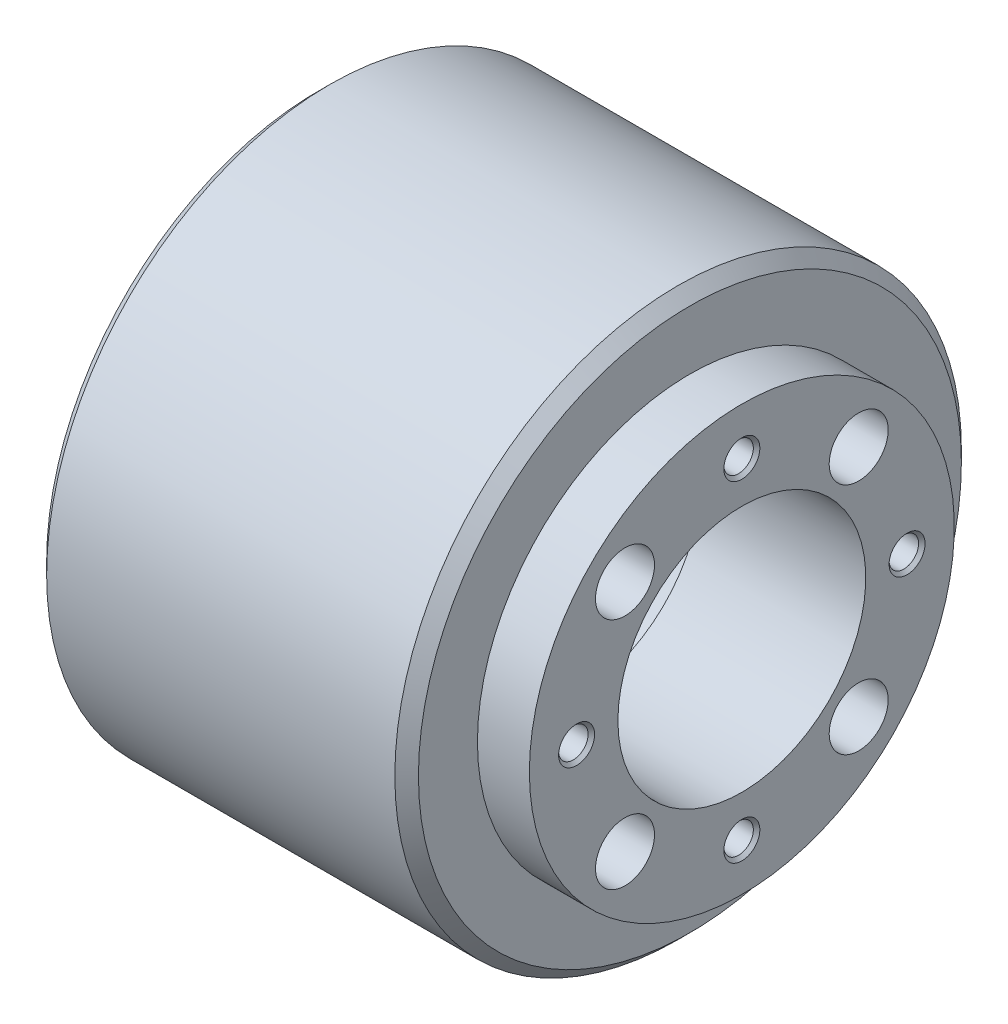
ISO-10303-21;
HEADER;
FILE_DESCRIPTION(('STEP AP214'),'2;1');
FILE_NAME('part.step','',(''),(''),'','','');
FILE_SCHEMA(('AUTOMOTIVE_DESIGN { 1 0 10303 214 1 1 1 1 }'));
ENDSEC;
DATA;
#1=APPLICATION_CONTEXT('core data for automotive mechanical design processes');
#2=APPLICATION_PROTOCOL_DEFINITION('international standard','automotive_design',2000,#1);
#3=PRODUCT_CONTEXT('',#1,'mechanical');
#4=PRODUCT('Part','Part','',(#3));
#5=PRODUCT_RELATED_PRODUCT_CATEGORY('part','',(#4));
#6=PRODUCT_DEFINITION_FORMATION('','',#4);
#7=PRODUCT_DEFINITION_CONTEXT('part definition',#1,'design');
#8=PRODUCT_DEFINITION('design','',#6,#7);
#9=PRODUCT_DEFINITION_SHAPE('','',#8);
#10=(LENGTH_UNIT() NAMED_UNIT(*) SI_UNIT(.MILLI.,.METRE.));
#11=(NAMED_UNIT(*) PLANE_ANGLE_UNIT() SI_UNIT($,.RADIAN.));
#12=(NAMED_UNIT(*) SI_UNIT($,.STERADIAN.) SOLID_ANGLE_UNIT());
#13=UNCERTAINTY_MEASURE_WITH_UNIT(LENGTH_MEASURE(1.E-05),#10,'distance_accuracy_value','');
#14=(GEOMETRIC_REPRESENTATION_CONTEXT(3) GLOBAL_UNCERTAINTY_ASSIGNED_CONTEXT((#13)) GLOBAL_UNIT_ASSIGNED_CONTEXT((#10,
#11,#12)) REPRESENTATION_CONTEXT('',''));
#15=CARTESIAN_POINT('',(0.,0.,0.));
#16=DIRECTION('',(0.,0.,1.));
#17=DIRECTION('',(1.,0.,0.));
#18=AXIS2_PLACEMENT_3D('',#15,#16,#17);
#19=CARTESIAN_POINT('',(0.,0.,-19.5));
#20=DIRECTION('',(1.,0.,0.));
#21=DIRECTION('',(0.,0.,-1.));
#22=AXIS2_PLACEMENT_3D('',#19,#20,#21);
#23=PLANE('',#22);
#24=CARTESIAN_POINT('',(0.,0.,0.));
#25=DIRECTION('',(1.,0.,0.));
#26=DIRECTION('',(0.,0.,-1.));
#27=AXIS2_PLACEMENT_3D('',#24,#25,#26);
#28=CIRCLE('',#27,20.5);
#29=CARTESIAN_POINT('',(0.,0.,-20.5));
#30=VERTEX_POINT('',#29);
#31=EDGE_CURVE('E144',#30,#30,#28,.T.);
#32=ORIENTED_EDGE('',*,*,#31,.T.);
#33=EDGE_LOOP('',(#32));
#34=FACE_BOUND('',#33,.T.);
#35=CARTESIAN_POINT('',(0.,0.,0.));
#36=DIRECTION('',(1.,0.,0.));
#37=DIRECTION('',(0.,0.,-1.));
#38=AXIS2_PLACEMENT_3D('',#35,#36,#37);
#39=CIRCLE('',#38,23.);
#40=CARTESIAN_POINT('',(0.,0.,-23.));
#41=VERTEX_POINT('',#40);
#42=EDGE_CURVE('E141',#41,#41,#39,.F.);
#43=ORIENTED_EDGE('',*,*,#42,.T.);
#44=EDGE_LOOP('',(#43));
#45=FACE_BOUND('',#44,.T.);
#46=ADVANCED_FACE('F46',(#34,#45),#23,.F.);
#47=CARTESIAN_POINT('',(0.,0.,0.));
#48=DIRECTION('',(-1.,0.,0.));
#49=DIRECTION('',(0.,0.,1.));
#50=AXIS2_PLACEMENT_3D('',#47,#48,#49);
#51=CYLINDRICAL_SURFACE('',#50,24.);
#52=CARTESIAN_POINT('',(30.5,0.,0.));
#53=DIRECTION('',(-1.,0.,0.));
#54=DIRECTION('',(0.,0.,1.));
#55=AXIS2_PLACEMENT_3D('',#52,#53,#54);
#56=CIRCLE('',#55,24.);
#57=CARTESIAN_POINT('',(30.5,0.,24.));
#58=VERTEX_POINT('',#57);
#59=EDGE_CURVE('E54',#58,#58,#56,.T.);
#60=ORIENTED_EDGE('',*,*,#59,.T.);
#61=EDGE_LOOP('',(#60));
#62=FACE_BOUND('',#61,.T.);
#63=CARTESIAN_POINT('',(0.99999999999999,0.,0.));
#64=DIRECTION('',(1.,0.,0.));
#65=DIRECTION('',(0.,0.,-1.));
#66=AXIS2_PLACEMENT_3D('',#63,#64,#65);
#67=CIRCLE('',#66,24.);
#68=CARTESIAN_POINT('',(0.99999999999999,0.,-24.));
#69=VERTEX_POINT('',#68);
#70=EDGE_CURVE('E147',#69,#69,#67,.T.);
#71=ORIENTED_EDGE('',*,*,#70,.T.);
#72=EDGE_LOOP('',(#71));
#73=FACE_BOUND('',#72,.T.);
#74=ADVANCED_FACE('F152',(#62,#73),#51,.T.);
#75=CARTESIAN_POINT('',(31.5,0.,-24.));
#76=DIRECTION('',(-1.,0.,0.));
#77=DIRECTION('',(0.,0.,1.));
#78=AXIS2_PLACEMENT_3D('',#75,#76,#77);
#79=PLANE('',#78);
#80=CARTESIAN_POINT('',(31.5,0.,0.));
#81=DIRECTION('',(-1.,0.,0.));
#82=DIRECTION('',(0.,0.,1.));
#83=AXIS2_PLACEMENT_3D('',#80,#81,#82);
#84=CIRCLE('',#83,23.);
#85=CARTESIAN_POINT('',(31.5,0.,23.));
#86=VERTEX_POINT('',#85);
#87=EDGE_CURVE('E13',#86,#86,#84,.F.);
#88=ORIENTED_EDGE('',*,*,#87,.T.);
#89=EDGE_LOOP('',(#88));
#90=FACE_BOUND('',#89,.T.);
#91=CARTESIAN_POINT('',(31.5,0.,0.));
#92=DIRECTION('',(-1.,0.,0.));
#93=DIRECTION('',(0.,0.,1.));
#94=AXIS2_PLACEMENT_3D('',#91,#92,#93);
#95=CIRCLE('',#94,18.);
#96=CARTESIAN_POINT('',(31.5,0.,18.));
#97=VERTEX_POINT('',#96);
#98=EDGE_CURVE('E123',#97,#97,#95,.T.);
#99=ORIENTED_EDGE('',*,*,#98,.T.);
#100=EDGE_LOOP('',(#99));
#101=FACE_BOUND('',#100,.T.);
#102=ADVANCED_FACE('F175',(#90,#101),#79,.F.);
#103=CARTESIAN_POINT('',(0.,0.,0.));
#104=DIRECTION('',(-1.,0.,0.));
#105=DIRECTION('',(0.,0.,1.));
#106=AXIS2_PLACEMENT_3D('',#103,#104,#105);
#107=CYLINDRICAL_SURFACE('',#106,18.);
#108=ORIENTED_EDGE('',*,*,#98,.F.);
#109=EDGE_LOOP('',(#108));
#110=FACE_BOUND('',#109,.T.);
#111=CARTESIAN_POINT('',(35.9,0.,0.));
#112=DIRECTION('',(-1.,0.,0.));
#113=DIRECTION('',(0.,0.,1.));
#114=AXIS2_PLACEMENT_3D('',#111,#112,#113);
#115=CIRCLE('',#114,18.);
#116=CARTESIAN_POINT('',(35.9,0.,18.));
#117=VERTEX_POINT('',#116);
#118=EDGE_CURVE('E120',#117,#117,#115,.T.);
#119=ORIENTED_EDGE('',*,*,#118,.T.);
#120=EDGE_LOOP('',(#119));
#121=FACE_BOUND('',#120,.T.);
#122=ADVANCED_FACE('F216',(#110,#121),#107,.T.);
#123=CARTESIAN_POINT('',(35.9,0.,-10.5));
#124=DIRECTION('',(-1.,0.,0.));
#125=DIRECTION('',(0.,0.,1.));
#126=AXIS2_PLACEMENT_3D('',#123,#124,#125);
#127=PLANE('',#126);
#128=CARTESIAN_POINT('',(35.9,-9.89949493661167,-9.89949493661166));
#129=DIRECTION('',(1.,0.,0.));
#130=DIRECTION('',(0.,0.,1.));
#131=AXIS2_PLACEMENT_3D('',#128,#129,#130);
#132=CIRCLE('',#131,2.5);
#133=CARTESIAN_POINT('',(35.9,-9.89949493661167,-7.39949493661166));
#134=VERTEX_POINT('',#133);
#135=EDGE_CURVE('E509',#134,#134,#132,.T.);
#136=ORIENTED_EDGE('',*,*,#135,.F.);
#137=EDGE_LOOP('',(#136));
#138=FACE_BOUND('',#137,.T.);
#139=CARTESIAN_POINT('',(35.9,-9.89949493661167,9.89949493661166));
#140=DIRECTION('',(1.,0.,0.));
#141=DIRECTION('',(0.,0.,-1.));
#142=AXIS2_PLACEMENT_3D('',#139,#140,#141);
#143=CIRCLE('',#142,2.5);
#144=CARTESIAN_POINT('',(35.9,-9.89949493661167,7.39949493661166));
#145=VERTEX_POINT('',#144);
#146=EDGE_CURVE('E508',#145,#145,#143,.T.);
#147=ORIENTED_EDGE('',*,*,#146,.F.);
#148=EDGE_LOOP('',(#147));
#149=FACE_BOUND('',#148,.T.);
#150=CARTESIAN_POINT('',(35.9,9.89949493661167,-9.89949493661167));
#151=DIRECTION('',(1.,0.,0.));
#152=DIRECTION('',(0.,0.,1.));
#153=AXIS2_PLACEMENT_3D('',#150,#151,#152);
#154=CIRCLE('',#153,2.5);
#155=CARTESIAN_POINT('',(35.9,9.89949493661167,-7.39949493661166));
#156=VERTEX_POINT('',#155);
#157=EDGE_CURVE('E518',#156,#156,#154,.T.);
#158=ORIENTED_EDGE('',*,*,#157,.F.);
#159=EDGE_LOOP('',(#158));
#160=FACE_BOUND('',#159,.T.);
#161=CARTESIAN_POINT('',(35.9,9.89949493661167,9.89949493661167));
#162=DIRECTION('',(1.,0.,0.));
#163=DIRECTION('',(0.,0.,-1.));
#164=AXIS2_PLACEMENT_3D('',#161,#162,#163);
#165=CIRCLE('',#164,2.5);
#166=CARTESIAN_POINT('',(35.9,9.89949493661167,7.39949493661166));
#167=VERTEX_POINT('',#166);
#168=EDGE_CURVE('E523',#167,#167,#165,.T.);
#169=ORIENTED_EDGE('',*,*,#168,.F.);
#170=EDGE_LOOP('',(#169));
#171=FACE_BOUND('',#170,.T.);
#172=CARTESIAN_POINT('',(35.9,14.,0.));
#173=DIRECTION('',(1.,0.,0.));
#174=DIRECTION('',(0.,0.,-1.));
#175=AXIS2_PLACEMENT_3D('',#172,#173,#174);
#176=CIRCLE('',#175,1.525);
#177=CARTESIAN_POINT('',(35.9,14.,-1.525));
#178=VERTEX_POINT('',#177);
#179=EDGE_CURVE('E84',#178,#178,#176,.T.);
#180=ORIENTED_EDGE('',*,*,#179,.F.);
#181=EDGE_LOOP('',(#180));
#182=FACE_BOUND('',#181,.T.);
#183=CARTESIAN_POINT('',(35.9,0.,-14.));
#184=DIRECTION('',(1.,0.,0.));
#185=DIRECTION('',(0.,0.,-1.));
#186=AXIS2_PLACEMENT_3D('',#183,#184,#185);
#187=CIRCLE('',#186,1.525);
#188=CARTESIAN_POINT('',(35.9,0.,-15.525));
#189=VERTEX_POINT('',#188);
#190=EDGE_CURVE('E77',#189,#189,#187,.T.);
#191=ORIENTED_EDGE('',*,*,#190,.F.);
#192=EDGE_LOOP('',(#191));
#193=FACE_BOUND('',#192,.T.);
#194=CARTESIAN_POINT('',(35.9,-14.,0.));
#195=DIRECTION('',(1.,0.,0.));
#196=DIRECTION('',(0.,0.,-1.));
#197=AXIS2_PLACEMENT_3D('',#194,#195,#196);
#198=CIRCLE('',#197,1.525);
#199=CARTESIAN_POINT('',(35.9,-14.,-1.525));
#200=VERTEX_POINT('',#199);
#201=EDGE_CURVE('E93',#200,#200,#198,.T.);
#202=ORIENTED_EDGE('',*,*,#201,.F.);
#203=EDGE_LOOP('',(#202));
#204=FACE_BOUND('',#203,.T.);
#205=CARTESIAN_POINT('',(35.9,0.,14.));
#206=DIRECTION('',(1.,0.,0.));
#207=DIRECTION('',(0.,0.,-1.));
#208=AXIS2_PLACEMENT_3D('',#205,#206,#207);
#209=CIRCLE('',#208,1.525);
#210=CARTESIAN_POINT('',(35.9,0.,12.475));
#211=VERTEX_POINT('',#210);
#212=EDGE_CURVE('E102',#211,#211,#209,.T.);
#213=ORIENTED_EDGE('',*,*,#212,.F.);
#214=EDGE_LOOP('',(#213));
#215=FACE_BOUND('',#214,.T.);
#216=ORIENTED_EDGE('',*,*,#118,.F.);
#217=EDGE_LOOP('',(#216));
#218=FACE_BOUND('',#217,.T.);
#219=CARTESIAN_POINT('',(35.9,0.,0.));
#220=DIRECTION('',(-1.,0.,0.));
#221=DIRECTION('',(0.,0.,1.));
#222=AXIS2_PLACEMENT_3D('',#219,#220,#221);
#223=CIRCLE('',#222,10.5);
#224=CARTESIAN_POINT('',(35.9,0.,10.5));
#225=VERTEX_POINT('',#224);
#226=EDGE_CURVE('E117',#225,#225,#223,.T.);
#227=ORIENTED_EDGE('',*,*,#226,.T.);
#228=EDGE_LOOP('',(#227));
#229=FACE_BOUND('',#228,.T.);
#230=ADVANCED_FACE('F208',(#138,#149,#160,#171,#182,#193,#204,#215,#218,#229),#127,.F.);
#231=CARTESIAN_POINT('',(0.,0.,0.));
#232=DIRECTION('',(-1.,0.,0.));
#233=DIRECTION('',(0.,0.,1.));
#234=AXIS2_PLACEMENT_3D('',#231,#232,#233);
#235=CYLINDRICAL_SURFACE('',#234,10.5);
#236=ORIENTED_EDGE('',*,*,#226,.F.);
#237=EDGE_LOOP('',(#236));
#238=FACE_BOUND('',#237,.T.);
#239=CARTESIAN_POINT('',(21.9,0.,0.));
#240=DIRECTION('',(-1.,0.,0.));
#241=DIRECTION('',(0.,0.,1.));
#242=AXIS2_PLACEMENT_3D('',#239,#240,#241);
#243=CIRCLE('',#242,10.5);
#244=CARTESIAN_POINT('',(21.9,0.,10.5));
#245=VERTEX_POINT('',#244);
#246=EDGE_CURVE('E114',#245,#245,#243,.T.);
#247=ORIENTED_EDGE('',*,*,#246,.T.);
#248=EDGE_LOOP('',(#247));
#249=FACE_BOUND('',#248,.T.);
#250=ADVANCED_FACE('F202',(#238,#249),#235,.F.);
#251=CARTESIAN_POINT('',(21.9,0.,-15.));
#252=DIRECTION('',(1.,0.,0.));
#253=DIRECTION('',(0.,0.,-1.));
#254=AXIS2_PLACEMENT_3D('',#251,#252,#253);
#255=PLANE('',#254);
#256=ORIENTED_EDGE('',*,*,#246,.F.);
#257=EDGE_LOOP('',(#256));
#258=FACE_BOUND('',#257,.T.);
#259=CARTESIAN_POINT('',(21.9,0.,0.));
#260=DIRECTION('',(-1.,0.,0.));
#261=DIRECTION('',(0.,0.,1.));
#262=AXIS2_PLACEMENT_3D('',#259,#260,#261);
#263=CIRCLE('',#262,15.);
#264=CARTESIAN_POINT('',(21.9,0.,15.));
#265=VERTEX_POINT('',#264);
#266=EDGE_CURVE('E111',#265,#265,#263,.T.);
#267=ORIENTED_EDGE('',*,*,#266,.T.);
#268=EDGE_LOOP('',(#267));
#269=FACE_BOUND('',#268,.T.);
#270=ADVANCED_FACE('F197',(#258,#269),#255,.F.);
#271=CARTESIAN_POINT('',(0.,0.,0.));
#272=DIRECTION('',(-1.,0.,0.));
#273=DIRECTION('',(0.,0.,1.));
#274=AXIS2_PLACEMENT_3D('',#271,#272,#273);
#275=CYLINDRICAL_SURFACE('',#274,15.);
#276=CARTESIAN_POINT('',(6.39999999999999,0.,0.));
#277=DIRECTION('',(1.,0.,0.));
#278=DIRECTION('',(0.,0.,-1.));
#279=AXIS2_PLACEMENT_3D('',#276,#277,#278);
#280=CIRCLE('',#279,15.);
#281=CARTESIAN_POINT('',(6.39999999999999,0.,-15.));
#282=VERTEX_POINT('',#281);
#283=EDGE_CURVE('E138',#282,#282,#280,.F.);
#284=ORIENTED_EDGE('',*,*,#283,.T.);
#285=EDGE_LOOP('',(#284));
#286=FACE_BOUND('',#285,.T.);
#287=ORIENTED_EDGE('',*,*,#266,.F.);
#288=EDGE_LOOP('',(#287));
#289=FACE_BOUND('',#288,.T.);
#290=ADVANCED_FACE('F193',(#286,#289),#275,.F.);
#291=CARTESIAN_POINT('',(5.4,0.,-15.));
#292=DIRECTION('',(1.,0.,0.));
#293=DIRECTION('',(0.,0.,-1.));
#294=AXIS2_PLACEMENT_3D('',#291,#292,#293);
#295=PLANE('',#294);
#296=CARTESIAN_POINT('',(5.4,0.,0.));
#297=DIRECTION('',(1.,0.,0.));
#298=DIRECTION('',(0.,0.,-1.));
#299=AXIS2_PLACEMENT_3D('',#296,#297,#298);
#300=CIRCLE('',#299,18.5);
#301=CARTESIAN_POINT('',(5.4,0.,-18.5));
#302=VERTEX_POINT('',#301);
#303=EDGE_CURVE('E129',#302,#302,#300,.F.);
#304=ORIENTED_EDGE('',*,*,#303,.T.);
#305=EDGE_LOOP('',(#304));
#306=FACE_BOUND('',#305,.T.);
#307=CARTESIAN_POINT('',(5.4,0.,0.));
#308=DIRECTION('',(1.,0.,0.));
#309=DIRECTION('',(0.,0.,-1.));
#310=AXIS2_PLACEMENT_3D('',#307,#308,#309);
#311=CIRCLE('',#310,16.);
#312=CARTESIAN_POINT('',(5.4,0.,-16.));
#313=VERTEX_POINT('',#312);
#314=EDGE_CURVE('E126',#313,#313,#311,.T.);
#315=ORIENTED_EDGE('',*,*,#314,.T.);
#316=EDGE_LOOP('',(#315));
#317=FACE_BOUND('',#316,.T.);
#318=ADVANCED_FACE('F196',(#306,#317),#295,.F.);
#319=CARTESIAN_POINT('',(0.,0.,0.));
#320=DIRECTION('',(-1.,0.,0.));
#321=DIRECTION('',(0.,0.,1.));
#322=AXIS2_PLACEMENT_3D('',#319,#320,#321);
#323=CYLINDRICAL_SURFACE('',#322,19.5);
#324=CARTESIAN_POINT('',(4.4,0.,0.));
#325=DIRECTION('',(1.,0.,0.));
#326=DIRECTION('',(0.,0.,-1.));
#327=AXIS2_PLACEMENT_3D('',#324,#325,#326);
#328=CIRCLE('',#327,19.5);
#329=CARTESIAN_POINT('',(4.4,0.,-19.5));
#330=VERTEX_POINT('',#329);
#331=EDGE_CURVE('E135',#330,#330,#328,.T.);
#332=ORIENTED_EDGE('',*,*,#331,.T.);
#333=EDGE_LOOP('',(#332));
#334=FACE_BOUND('',#333,.T.);
#335=CARTESIAN_POINT('',(1.00000000000002,0.,0.));
#336=DIRECTION('',(1.,0.,0.));
#337=DIRECTION('',(0.,0.,-1.));
#338=AXIS2_PLACEMENT_3D('',#335,#336,#337);
#339=CIRCLE('',#338,19.5);
#340=CARTESIAN_POINT('',(1.00000000000002,0.,-19.5));
#341=VERTEX_POINT('',#340);
#342=EDGE_CURVE('E132',#341,#341,#339,.F.);
#343=ORIENTED_EDGE('',*,*,#342,.T.);
#344=EDGE_LOOP('',(#343));
#345=FACE_BOUND('',#344,.T.);
#346=ADVANCED_FACE('F183',(#334,#345),#323,.F.);
#347=CARTESIAN_POINT('',(5.4,0.,0.));
#348=DIRECTION('',(-1.,0.,0.));
#349=DIRECTION('',(0.,0.,1.));
#350=AXIS2_PLACEMENT_3D('',#347,#348,#349);
#351=CONICAL_SURFACE('',#350,18.5,0.785398163397454);
#352=ORIENTED_EDGE('',*,*,#331,.F.);
#353=EDGE_LOOP('',(#352));
#354=FACE_BOUND('',#353,.T.);
#355=ORIENTED_EDGE('',*,*,#303,.F.);
#356=EDGE_LOOP('',(#355));
#357=FACE_BOUND('',#356,.T.);
#358=ADVANCED_FACE('F180',(#354,#357),#351,.F.);
#359=CARTESIAN_POINT('',(6.39999999999999,0.,0.));
#360=DIRECTION('',(-1.,0.,0.));
#361=DIRECTION('',(0.,0.,1.));
#362=AXIS2_PLACEMENT_3D('',#359,#360,#361);
#363=CONICAL_SURFACE('',#362,15.,0.785398163397453);
#364=ORIENTED_EDGE('',*,*,#314,.F.);
#365=EDGE_LOOP('',(#364));
#366=FACE_BOUND('',#365,.T.);
#367=ORIENTED_EDGE('',*,*,#283,.F.);
#368=EDGE_LOOP('',(#367));
#369=FACE_BOUND('',#368,.T.);
#370=ADVANCED_FACE('F165',(#366,#369),#363,.F.);
#371=CARTESIAN_POINT('',(1.00000000000002,0.,0.));
#372=DIRECTION('',(-1.,0.,0.));
#373=DIRECTION('',(0.,0.,1.));
#374=AXIS2_PLACEMENT_3D('',#371,#372,#373);
#375=CONICAL_SURFACE('',#374,19.5,0.785398163397447);
#376=ORIENTED_EDGE('',*,*,#31,.F.);
#377=EDGE_LOOP('',(#376));
#378=FACE_BOUND('',#377,.T.);
#379=ORIENTED_EDGE('',*,*,#342,.F.);
#380=EDGE_LOOP('',(#379));
#381=FACE_BOUND('',#380,.T.);
#382=ADVANCED_FACE('F157',(#378,#381),#375,.F.);
#383=CARTESIAN_POINT('',(30.5,0.,0.));
#384=DIRECTION('',(-1.,0.,0.));
#385=DIRECTION('',(0.,0.,1.));
#386=AXIS2_PLACEMENT_3D('',#383,#384,#385);
#387=CONICAL_SURFACE('',#386,24.,0.785398163397453);
#388=ORIENTED_EDGE('',*,*,#87,.F.);
#389=EDGE_LOOP('',(#388));
#390=FACE_BOUND('',#389,.T.);
#391=ORIENTED_EDGE('',*,*,#59,.F.);
#392=EDGE_LOOP('',(#391));
#393=FACE_BOUND('',#392,.T.);
#394=ADVANCED_FACE('F155',(#390,#393),#387,.T.);
#395=CARTESIAN_POINT('',(0.,0.,0.));
#396=DIRECTION('',(1.,0.,0.));
#397=DIRECTION('',(0.,0.,-1.));
#398=AXIS2_PLACEMENT_3D('',#395,#396,#397);
#399=CONICAL_SURFACE('',#398,23.,0.785398163397445);
#400=ORIENTED_EDGE('',*,*,#70,.F.);
#401=EDGE_LOOP('',(#400));
#402=FACE_BOUND('',#401,.T.);
#403=ORIENTED_EDGE('',*,*,#42,.F.);
#404=EDGE_LOOP('',(#403));
#405=FACE_BOUND('',#404,.T.);
#406=ADVANCED_FACE('F48',(#402,#405),#399,.T.);
#407=CARTESIAN_POINT('',(24.9,0.,14.));
#408=DIRECTION('',(1.,0.,0.));
#409=DIRECTION('',(0.,0.,-1.));
#410=AXIS2_PLACEMENT_3D('',#407,#408,#409);
#411=CONICAL_SURFACE('',#410,1.25,1.02974425867665);
#412=CARTESIAN_POINT('',(24.1489242262156,0.,14.));
#413=VERTEX_POINT('',#412);
#414=VERTEX_LOOP('',#413);
#415=FACE_BOUND('',#414,.T.);
#416=CARTESIAN_POINT('',(24.9,0.,14.));
#417=DIRECTION('',(1.,0.,0.));
#418=DIRECTION('',(0.,0.,-1.));
#419=AXIS2_PLACEMENT_3D('',#416,#417,#418);
#420=CIRCLE('',#419,1.25);
#421=CARTESIAN_POINT('',(24.9,0.,12.75));
#422=VERTEX_POINT('',#421);
#423=EDGE_CURVE('E108',#422,#422,#420,.T.);
#424=ORIENTED_EDGE('',*,*,#423,.T.);
#425=EDGE_LOOP('',(#424));
#426=FACE_BOUND('',#425,.T.);
#427=ADVANCED_FACE('F163',(#415,#426),#411,.F.);
#428=CARTESIAN_POINT('',(35.9,0.,14.));
#429=DIRECTION('',(1.,0.,0.));
#430=DIRECTION('',(0.,0.,-1.));
#431=AXIS2_PLACEMENT_3D('',#428,#429,#430);
#432=CYLINDRICAL_SURFACE('',#431,1.25);
#433=ORIENTED_EDGE('',*,*,#423,.F.);
#434=EDGE_LOOP('',(#433));
#435=FACE_BOUND('',#434,.T.);
#436=CARTESIAN_POINT('',(35.625,0.,14.));
#437=DIRECTION('',(1.,0.,0.));
#438=DIRECTION('',(0.,0.,-1.));
#439=AXIS2_PLACEMENT_3D('',#436,#437,#438);
#440=CIRCLE('',#439,1.25);
#441=CARTESIAN_POINT('',(35.625,0.,12.75));
#442=VERTEX_POINT('',#441);
#443=EDGE_CURVE('E105',#442,#442,#440,.T.);
#444=ORIENTED_EDGE('',*,*,#443,.T.);
#445=EDGE_LOOP('',(#444));
#446=FACE_BOUND('',#445,.T.);
#447=ADVANCED_FACE('F322',(#435,#446),#432,.F.);
#448=CARTESIAN_POINT('',(35.9,0.,14.));
#449=DIRECTION('',(1.,0.,0.));
#450=DIRECTION('',(0.,0.,-1.));
#451=AXIS2_PLACEMENT_3D('',#448,#449,#450);
#452=CONICAL_SURFACE('',#451,1.525,0.785398163397442);
#453=ORIENTED_EDGE('',*,*,#443,.F.);
#454=EDGE_LOOP('',(#453));
#455=FACE_BOUND('',#454,.T.);
#456=ORIENTED_EDGE('',*,*,#212,.T.);
#457=EDGE_LOOP('',(#456));
#458=FACE_BOUND('',#457,.T.);
#459=ADVANCED_FACE('F330',(#455,#458),#452,.F.);
#460=CARTESIAN_POINT('',(24.9,-14.,0.));
#461=DIRECTION('',(1.,0.,0.));
#462=DIRECTION('',(0.,0.,-1.));
#463=AXIS2_PLACEMENT_3D('',#460,#461,#462);
#464=CONICAL_SURFACE('',#463,1.25,1.02974425867665);
#465=CARTESIAN_POINT('',(24.1489242262156,-14.,0.));
#466=VERTEX_POINT('',#465);
#467=VERTEX_LOOP('',#466);
#468=FACE_BOUND('',#467,.T.);
#469=CARTESIAN_POINT('',(24.9,-14.,0.));
#470=DIRECTION('',(1.,0.,0.));
#471=DIRECTION('',(0.,0.,-1.));
#472=AXIS2_PLACEMENT_3D('',#469,#470,#471);
#473=CIRCLE('',#472,1.25);
#474=CARTESIAN_POINT('',(24.9,-14.,-1.25));
#475=VERTEX_POINT('',#474);
#476=EDGE_CURVE('E99',#475,#475,#473,.T.);
#477=ORIENTED_EDGE('',*,*,#476,.T.);
#478=EDGE_LOOP('',(#477));
#479=FACE_BOUND('',#478,.T.);
#480=ADVANCED_FACE('F339',(#468,#479),#464,.F.);
#481=CARTESIAN_POINT('',(35.9,-14.,0.));
#482=DIRECTION('',(1.,0.,0.));
#483=DIRECTION('',(0.,0.,-1.));
#484=AXIS2_PLACEMENT_3D('',#481,#482,#483);
#485=CYLINDRICAL_SURFACE('',#484,1.25);
#486=ORIENTED_EDGE('',*,*,#476,.F.);
#487=EDGE_LOOP('',(#486));
#488=FACE_BOUND('',#487,.T.);
#489=CARTESIAN_POINT('',(35.625,-14.,0.));
#490=DIRECTION('',(1.,0.,0.));
#491=DIRECTION('',(0.,0.,-1.));
#492=AXIS2_PLACEMENT_3D('',#489,#490,#491);
#493=CIRCLE('',#492,1.25);
#494=CARTESIAN_POINT('',(35.625,-14.,-1.25));
#495=VERTEX_POINT('',#494);
#496=EDGE_CURVE('E96',#495,#495,#493,.T.);
#497=ORIENTED_EDGE('',*,*,#496,.T.);
#498=EDGE_LOOP('',(#497));
#499=FACE_BOUND('',#498,.T.);
#500=ADVANCED_FACE('F348',(#488,#499),#485,.F.);
#501=CARTESIAN_POINT('',(35.9,-14.,0.));
#502=DIRECTION('',(1.,0.,0.));
#503=DIRECTION('',(0.,0.,-1.));
#504=AXIS2_PLACEMENT_3D('',#501,#502,#503);
#505=CONICAL_SURFACE('',#504,1.525,0.785398163397442);
#506=ORIENTED_EDGE('',*,*,#496,.F.);
#507=EDGE_LOOP('',(#506));
#508=FACE_BOUND('',#507,.T.);
#509=ORIENTED_EDGE('',*,*,#201,.T.);
#510=EDGE_LOOP('',(#509));
#511=FACE_BOUND('',#510,.T.);
#512=ADVANCED_FACE('F356',(#508,#511),#505,.F.);
#513=CARTESIAN_POINT('',(24.9,0.,-14.));
#514=DIRECTION('',(1.,0.,0.));
#515=DIRECTION('',(0.,0.,-1.));
#516=AXIS2_PLACEMENT_3D('',#513,#514,#515);
#517=CONICAL_SURFACE('',#516,1.25,1.02974425867665);
#518=CARTESIAN_POINT('',(24.1489242262156,0.,-14.));
#519=VERTEX_POINT('',#518);
#520=VERTEX_LOOP('',#519);
#521=FACE_BOUND('',#520,.T.);
#522=CARTESIAN_POINT('',(24.9,0.,-14.));
#523=DIRECTION('',(1.,0.,0.));
#524=DIRECTION('',(0.,0.,-1.));
#525=AXIS2_PLACEMENT_3D('',#522,#523,#524);
#526=CIRCLE('',#525,1.25);
#527=CARTESIAN_POINT('',(24.9,0.,-15.25));
#528=VERTEX_POINT('',#527);
#529=EDGE_CURVE('E90',#528,#528,#526,.T.);
#530=ORIENTED_EDGE('',*,*,#529,.T.);
#531=EDGE_LOOP('',(#530));
#532=FACE_BOUND('',#531,.T.);
#533=ADVANCED_FACE('F365',(#521,#532),#517,.F.);
#534=CARTESIAN_POINT('',(35.9,0.,-14.));
#535=DIRECTION('',(1.,0.,0.));
#536=DIRECTION('',(0.,0.,-1.));
#537=AXIS2_PLACEMENT_3D('',#534,#535,#536);
#538=CYLINDRICAL_SURFACE('',#537,1.25);
#539=ORIENTED_EDGE('',*,*,#529,.F.);
#540=EDGE_LOOP('',(#539));
#541=FACE_BOUND('',#540,.T.);
#542=CARTESIAN_POINT('',(35.625,0.,-14.));
#543=DIRECTION('',(1.,0.,0.));
#544=DIRECTION('',(0.,0.,-1.));
#545=AXIS2_PLACEMENT_3D('',#542,#543,#544);
#546=CIRCLE('',#545,1.25);
#547=CARTESIAN_POINT('',(35.625,0.,-15.25));
#548=VERTEX_POINT('',#547);
#549=EDGE_CURVE('E81',#548,#548,#546,.T.);
#550=ORIENTED_EDGE('',*,*,#549,.T.);
#551=EDGE_LOOP('',(#550));
#552=FACE_BOUND('',#551,.T.);
#553=ADVANCED_FACE('F374',(#541,#552),#538,.F.);
#554=CARTESIAN_POINT('',(35.9,0.,-14.));
#555=DIRECTION('',(1.,0.,0.));
#556=DIRECTION('',(0.,0.,-1.));
#557=AXIS2_PLACEMENT_3D('',#554,#555,#556);
#558=CONICAL_SURFACE('',#557,1.525,0.785398163397442);
#559=ORIENTED_EDGE('',*,*,#549,.F.);
#560=EDGE_LOOP('',(#559));
#561=FACE_BOUND('',#560,.T.);
#562=ORIENTED_EDGE('',*,*,#190,.T.);
#563=EDGE_LOOP('',(#562));
#564=FACE_BOUND('',#563,.T.);
#565=ADVANCED_FACE('F71',(#561,#564),#558,.F.);
#566=CARTESIAN_POINT('',(24.9,14.,0.));
#567=DIRECTION('',(1.,0.,0.));
#568=DIRECTION('',(0.,0.,-1.));
#569=AXIS2_PLACEMENT_3D('',#566,#567,#568);
#570=CONICAL_SURFACE('',#569,1.25,1.02974425867665);
#571=CARTESIAN_POINT('',(24.1489242262156,14.,0.));
#572=VERTEX_POINT('',#571);
#573=VERTEX_LOOP('',#572);
#574=FACE_BOUND('',#573,.T.);
#575=CARTESIAN_POINT('',(24.9,14.,0.));
#576=DIRECTION('',(1.,0.,0.));
#577=DIRECTION('',(0.,0.,-1.));
#578=AXIS2_PLACEMENT_3D('',#575,#576,#577);
#579=CIRCLE('',#578,1.25);
#580=CARTESIAN_POINT('',(24.9,14.,-1.25));
#581=VERTEX_POINT('',#580);
#582=EDGE_CURVE('E75',#581,#581,#579,.T.);
#583=ORIENTED_EDGE('',*,*,#582,.T.);
#584=EDGE_LOOP('',(#583));
#585=FACE_BOUND('',#584,.T.);
#586=ADVANCED_FACE('F67',(#574,#585),#570,.F.);
#587=CARTESIAN_POINT('',(35.9,14.,0.));
#588=DIRECTION('',(1.,0.,0.));
#589=DIRECTION('',(0.,0.,-1.));
#590=AXIS2_PLACEMENT_3D('',#587,#588,#589);
#591=CYLINDRICAL_SURFACE('',#590,1.25);
#592=ORIENTED_EDGE('',*,*,#582,.F.);
#593=EDGE_LOOP('',(#592));
#594=FACE_BOUND('',#593,.T.);
#595=CARTESIAN_POINT('',(35.625,14.,0.));
#596=DIRECTION('',(1.,0.,0.));
#597=DIRECTION('',(0.,0.,-1.));
#598=AXIS2_PLACEMENT_3D('',#595,#596,#597);
#599=CIRCLE('',#598,1.25);
#600=CARTESIAN_POINT('',(35.625,14.,-1.25));
#601=VERTEX_POINT('',#600);
#602=EDGE_CURVE('E78',#601,#601,#599,.T.);
#603=ORIENTED_EDGE('',*,*,#602,.T.);
#604=EDGE_LOOP('',(#603));
#605=FACE_BOUND('',#604,.T.);
#606=ADVANCED_FACE('F70',(#594,#605),#591,.F.);
#607=CARTESIAN_POINT('',(35.9,14.,0.));
#608=DIRECTION('',(1.,0.,0.));
#609=DIRECTION('',(0.,0.,-1.));
#610=AXIS2_PLACEMENT_3D('',#607,#608,#609);
#611=CONICAL_SURFACE('',#610,1.525,0.785398163397442);
#612=ORIENTED_EDGE('',*,*,#602,.F.);
#613=EDGE_LOOP('',(#612));
#614=FACE_BOUND('',#613,.T.);
#615=ORIENTED_EDGE('',*,*,#179,.T.);
#616=EDGE_LOOP('',(#615));
#617=FACE_BOUND('',#616,.T.);
#618=ADVANCED_FACE('F404',(#614,#617),#611,.F.);
#619=CARTESIAN_POINT('',(25.9,9.89949493661167,9.89949493661167));
#620=DIRECTION('',(1.,0.,0.));
#621=DIRECTION('',(0.,0.,-1.));
#622=AXIS2_PLACEMENT_3D('',#619,#620,#621);
#623=CYLINDRICAL_SURFACE('',#622,2.5);
#624=CARTESIAN_POINT('',(25.9,9.89949493661167,9.89949493661167));
#625=DIRECTION('',(1.,0.,0.));
#626=DIRECTION('',(0.,0.,-1.));
#627=AXIS2_PLACEMENT_3D('',#624,#625,#626);
#628=CIRCLE('',#627,2.5);
#629=CARTESIAN_POINT('',(25.9,9.89949493661167,7.39949493661166));
#630=VERTEX_POINT('',#629);
#631=EDGE_CURVE('E526',#630,#630,#628,.T.);
#632=ORIENTED_EDGE('',*,*,#631,.F.);
#633=EDGE_LOOP('',(#632));
#634=FACE_BOUND('',#633,.T.);
#635=ORIENTED_EDGE('',*,*,#168,.T.);
#636=EDGE_LOOP('',(#635));
#637=FACE_BOUND('',#636,.T.);
#638=ADVANCED_FACE('F411',(#634,#637),#623,.F.);
#639=CARTESIAN_POINT('',(25.9,9.89949493661167,9.89949493661167));
#640=DIRECTION('',(1.,0.,0.));
#641=DIRECTION('',(0.,0.,-1.));
#642=AXIS2_PLACEMENT_3D('',#639,#640,#641);
#643=PLANE('',#642);
#644=ORIENTED_EDGE('',*,*,#631,.T.);
#645=EDGE_LOOP('',(#644));
#646=FACE_BOUND('',#645,.T.);
#647=ADVANCED_FACE('F419',(#646),#643,.T.);
#648=CARTESIAN_POINT('',(25.9,9.89949493661167,-9.89949493661167));
#649=DIRECTION('',(1.,0.,0.));
#650=DIRECTION('',(0.,0.,-1.));
#651=AXIS2_PLACEMENT_3D('',#648,#649,#650);
#652=CYLINDRICAL_SURFACE('',#651,2.5);
#653=CARTESIAN_POINT('',(25.9,9.89949493661167,-9.89949493661167));
#654=DIRECTION('',(1.,0.,0.));
#655=DIRECTION('',(0.,0.,1.));
#656=AXIS2_PLACEMENT_3D('',#653,#654,#655);
#657=CIRCLE('',#656,2.5);
#658=CARTESIAN_POINT('',(25.9,9.89949493661167,-7.39949493661166));
#659=VERTEX_POINT('',#658);
#660=EDGE_CURVE('E520',#659,#659,#657,.T.);
#661=ORIENTED_EDGE('',*,*,#660,.F.);
#662=EDGE_LOOP('',(#661));
#663=FACE_BOUND('',#662,.T.);
#664=ORIENTED_EDGE('',*,*,#157,.T.);
#665=EDGE_LOOP('',(#664));
#666=FACE_BOUND('',#665,.T.);
#667=ADVANCED_FACE('F428',(#663,#666),#652,.F.);
#668=CARTESIAN_POINT('',(25.9,9.89949493661167,-9.89949493661167));
#669=DIRECTION('',(-1.,0.,0.));
#670=DIRECTION('',(0.,0.,1.));
#671=AXIS2_PLACEMENT_3D('',#668,#669,#670);
#672=PLANE('',#671);
#673=ORIENTED_EDGE('',*,*,#660,.T.);
#674=EDGE_LOOP('',(#673));
#675=FACE_BOUND('',#674,.T.);
#676=ADVANCED_FACE('F437',(#675),#672,.F.);
#677=CARTESIAN_POINT('',(25.9,-9.89949493661167,9.89949493661166));
#678=DIRECTION('',(1.,0.,0.));
#679=DIRECTION('',(0.,0.,-1.));
#680=AXIS2_PLACEMENT_3D('',#677,#678,#679);
#681=CYLINDRICAL_SURFACE('',#680,2.5);
#682=CARTESIAN_POINT('',(25.9,-9.89949493661167,9.89949493661166));
#683=DIRECTION('',(1.,0.,0.));
#684=DIRECTION('',(0.,0.,-1.));
#685=AXIS2_PLACEMENT_3D('',#682,#683,#684);
#686=CIRCLE('',#685,2.5);
#687=CARTESIAN_POINT('',(25.9,-9.89949493661167,7.39949493661166));
#688=VERTEX_POINT('',#687);
#689=EDGE_CURVE('E512',#688,#688,#686,.T.);
#690=ORIENTED_EDGE('',*,*,#689,.F.);
#691=EDGE_LOOP('',(#690));
#692=FACE_BOUND('',#691,.T.);
#693=ORIENTED_EDGE('',*,*,#146,.T.);
#694=EDGE_LOOP('',(#693));
#695=FACE_BOUND('',#694,.T.);
#696=ADVANCED_FACE('F446',(#692,#695),#681,.F.);
#697=CARTESIAN_POINT('',(25.9,-9.89949493661167,9.89949493661166));
#698=DIRECTION('',(1.,0.,0.));
#699=DIRECTION('',(0.,0.,-1.));
#700=AXIS2_PLACEMENT_3D('',#697,#698,#699);
#701=PLANE('',#700);
#702=ORIENTED_EDGE('',*,*,#689,.T.);
#703=EDGE_LOOP('',(#702));
#704=FACE_BOUND('',#703,.T.);
#705=ADVANCED_FACE('F455',(#704),#701,.T.);
#706=CARTESIAN_POINT('',(25.9,-9.89949493661167,-9.89949493661166));
#707=DIRECTION('',(1.,0.,0.));
#708=DIRECTION('',(0.,0.,-1.));
#709=AXIS2_PLACEMENT_3D('',#706,#707,#708);
#710=CYLINDRICAL_SURFACE('',#709,2.5);
#711=CARTESIAN_POINT('',(25.9,-9.89949493661167,-9.89949493661166));
#712=DIRECTION('',(1.,0.,0.));
#713=DIRECTION('',(0.,0.,1.));
#714=AXIS2_PLACEMENT_3D('',#711,#712,#713);
#715=CIRCLE('',#714,2.5);
#716=CARTESIAN_POINT('',(25.9,-9.89949493661167,-7.39949493661166));
#717=VERTEX_POINT('',#716);
#718=EDGE_CURVE('E507',#717,#717,#715,.T.);
#719=ORIENTED_EDGE('',*,*,#718,.F.);
#720=EDGE_LOOP('',(#719));
#721=FACE_BOUND('',#720,.T.);
#722=ORIENTED_EDGE('',*,*,#135,.T.);
#723=EDGE_LOOP('',(#722));
#724=FACE_BOUND('',#723,.T.);
#725=ADVANCED_FACE('F464',(#721,#724),#710,.F.);
#726=CARTESIAN_POINT('',(25.9,-9.89949493661167,-9.89949493661166));
#727=DIRECTION('',(-1.,0.,0.));
#728=DIRECTION('',(0.,0.,1.));
#729=AXIS2_PLACEMENT_3D('',#726,#727,#728);
#730=PLANE('',#729);
#731=ORIENTED_EDGE('',*,*,#718,.T.);
#732=EDGE_LOOP('',(#731));
#733=FACE_BOUND('',#732,.T.);
#734=ADVANCED_FACE('F473',(#733),#730,.F.);
#735=CLOSED_SHELL('',(#46,#74,#102,#122,#230,#250,#270,#290,#318,#346,#358,#370,#382,#394,#406,
#427,#447,#459,#480,#500,#512,#533,#553,#565,#586,#606,#618,#638,#647,#667,#676,#696,#705,#725,#734));
#736=MANIFOLD_SOLID_BREP('B2',#735);
#737=ADVANCED_BREP_SHAPE_REPRESENTATION('',(#18,#736),#14);
#738=SHAPE_DEFINITION_REPRESENTATION(#9,#737);
ENDSEC;
END-ISO-10303-21;
